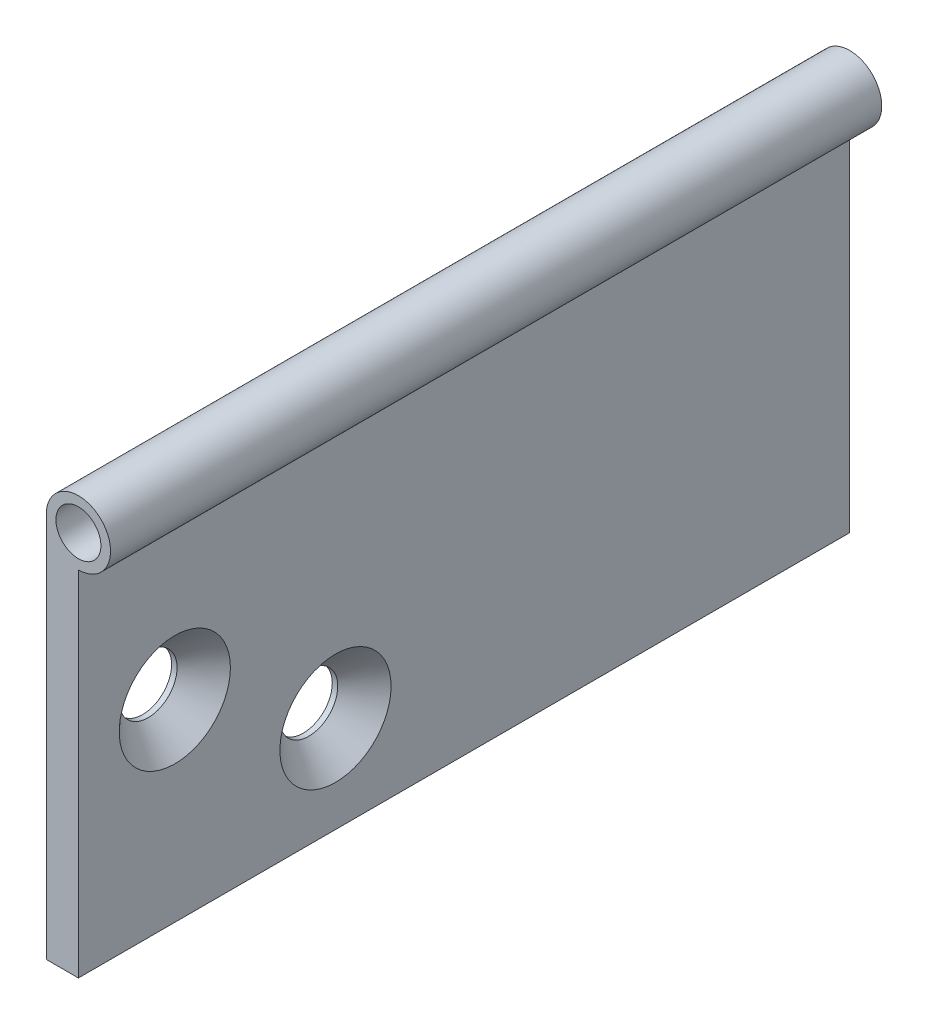
ISO-10303-21;
HEADER;
FILE_DESCRIPTION(('STEP AP214'),'2;1');
FILE_NAME('part.step','',(''),(''),'','','');
FILE_SCHEMA(('AUTOMOTIVE_DESIGN { 1 0 10303 214 1 1 1 1 }'));
ENDSEC;
DATA;
#1=APPLICATION_CONTEXT('core data for automotive mechanical design processes');
#2=APPLICATION_PROTOCOL_DEFINITION('international standard','automotive_design',2000,#1);
#3=PRODUCT_CONTEXT('',#1,'mechanical');
#4=PRODUCT('Part','Part','',(#3));
#5=PRODUCT_RELATED_PRODUCT_CATEGORY('part','',(#4));
#6=PRODUCT_DEFINITION_FORMATION('','',#4);
#7=PRODUCT_DEFINITION_CONTEXT('part definition',#1,'design');
#8=PRODUCT_DEFINITION('design','',#6,#7);
#9=PRODUCT_DEFINITION_SHAPE('','',#8);
#10=(LENGTH_UNIT() NAMED_UNIT(*) SI_UNIT(.MILLI.,.METRE.));
#11=(NAMED_UNIT(*) PLANE_ANGLE_UNIT() SI_UNIT($,.RADIAN.));
#12=(NAMED_UNIT(*) SI_UNIT($,.STERADIAN.) SOLID_ANGLE_UNIT());
#13=UNCERTAINTY_MEASURE_WITH_UNIT(LENGTH_MEASURE(1.E-05),#10,'distance_accuracy_value','');
#14=(GEOMETRIC_REPRESENTATION_CONTEXT(3) GLOBAL_UNCERTAINTY_ASSIGNED_CONTEXT((#13)) GLOBAL_UNIT_ASSIGNED_CONTEXT((#10,
#11,#12)) REPRESENTATION_CONTEXT('',''));
#15=CARTESIAN_POINT('',(0.,0.,0.));
#16=DIRECTION('',(0.,0.,1.));
#17=DIRECTION('',(1.,0.,0.));
#18=AXIS2_PLACEMENT_3D('',#15,#16,#17);
#19=CARTESIAN_POINT('',(5.,0.,60.));
#20=DIRECTION('',(-1.,0.,0.));
#21=DIRECTION('',(0.,0.,1.));
#22=AXIS2_PLACEMENT_3D('',#19,#20,#21);
#23=PLANE('',#22);
#24=CARTESIAN_POINT('',(5.,30.,45.));
#25=DIRECTION('',(1.,0.,0.));
#26=DIRECTION('',(0.,0.,-1.));
#27=AXIS2_PLACEMENT_3D('',#24,#25,#26);
#28=CIRCLE('',#27,8.65);
#29=CARTESIAN_POINT('',(5.,30.,36.35));
#30=VERTEX_POINT('',#29);
#31=EDGE_CURVE('E116',#30,#30,#28,.T.);
#32=ORIENTED_EDGE('',*,*,#31,.F.);
#33=EDGE_LOOP('',(#32));
#34=FACE_BOUND('',#33,.T.);
#35=CARTESIAN_POINT('',(5.,15.,20.));
#36=DIRECTION('',(1.,0.,0.));
#37=DIRECTION('',(0.,0.,-1.));
#38=AXIS2_PLACEMENT_3D('',#35,#36,#37);
#39=CIRCLE('',#38,8.65);
#40=CARTESIAN_POINT('',(5.,15.,11.35));
#41=VERTEX_POINT('',#40);
#42=EDGE_CURVE('E107',#41,#41,#39,.T.);
#43=ORIENTED_EDGE('',*,*,#42,.F.);
#44=EDGE_LOOP('',(#43));
#45=FACE_BOUND('',#44,.T.);
#46=DIRECTION('',(0.,1.,0.));
#47=VECTOR('',#46,1.);
#48=CARTESIAN_POINT('',(5.,0.,-60.));
#49=LINE('',#48,#47);
#50=CARTESIAN_POINT('',(5.,0.,-60.));
#51=VERTEX_POINT('',#50);
#52=CARTESIAN_POINT('',(5.,55.,-60.));
#53=VERTEX_POINT('',#52);
#54=EDGE_CURVE('E65',#51,#53,#49,.T.);
#55=ORIENTED_EDGE('',*,*,#54,.T.);
#56=DIRECTION('',(0.,0.,1.));
#57=VECTOR('',#56,1.);
#58=CARTESIAN_POINT('',(5.,55.,-60.));
#59=LINE('',#58,#57);
#60=CARTESIAN_POINT('',(5.,55.,60.));
#61=VERTEX_POINT('',#60);
#62=EDGE_CURVE('E79',#53,#61,#59,.T.);
#63=ORIENTED_EDGE('',*,*,#62,.T.);
#64=DIRECTION('',(0.,1.,0.));
#65=VECTOR('',#64,1.);
#66=CARTESIAN_POINT('',(5.,0.,60.));
#67=LINE('',#66,#65);
#68=CARTESIAN_POINT('',(5.,0.,60.));
#69=VERTEX_POINT('',#68);
#70=EDGE_CURVE('E67',#69,#61,#67,.T.);
#71=ORIENTED_EDGE('',*,*,#70,.F.);
#72=DIRECTION('',(0.,0.,-1.));
#73=VECTOR('',#72,1.);
#74=CARTESIAN_POINT('',(5.,0.,60.));
#75=LINE('',#74,#73);
#76=EDGE_CURVE('E48',#69,#51,#75,.T.);
#77=ORIENTED_EDGE('',*,*,#76,.T.);
#78=EDGE_LOOP('',(#55,#63,#71,#77));
#79=FACE_BOUND('',#78,.T.);
#80=ADVANCED_FACE('F32',(#34,#45,#79),#23,.F.);
#81=CARTESIAN_POINT('',(0.,0.,60.));
#82=DIRECTION('',(-1.,0.,0.));
#83=DIRECTION('',(0.,0.,1.));
#84=AXIS2_PLACEMENT_3D('',#81,#82,#83);
#85=PLANE('',#84);
#86=CARTESIAN_POINT('',(0.,30.,45.));
#87=DIRECTION('',(1.,0.,0.));
#88=DIRECTION('',(0.,0.,-1.));
#89=AXIS2_PLACEMENT_3D('',#86,#87,#88);
#90=CIRCLE('',#89,4.5);
#91=CARTESIAN_POINT('',(0.,30.,40.5));
#92=VERTEX_POINT('',#91);
#93=EDGE_CURVE('E110',#92,#92,#90,.T.);
#94=ORIENTED_EDGE('',*,*,#93,.T.);
#95=EDGE_LOOP('',(#94));
#96=FACE_BOUND('',#95,.T.);
#97=CARTESIAN_POINT('',(0.,15.,20.));
#98=DIRECTION('',(1.,0.,0.));
#99=DIRECTION('',(0.,0.,-1.));
#100=AXIS2_PLACEMENT_3D('',#97,#98,#99);
#101=CIRCLE('',#100,4.5);
#102=CARTESIAN_POINT('',(0.,15.,15.5));
#103=VERTEX_POINT('',#102);
#104=EDGE_CURVE('E99',#103,#103,#101,.T.);
#105=ORIENTED_EDGE('',*,*,#104,.T.);
#106=EDGE_LOOP('',(#105));
#107=FACE_BOUND('',#106,.T.);
#108=DIRECTION('',(0.,1.,0.));
#109=VECTOR('',#108,1.);
#110=CARTESIAN_POINT('',(0.,0.,-60.));
#111=LINE('',#110,#109);
#112=CARTESIAN_POINT('',(0.,0.,-60.));
#113=VERTEX_POINT('',#112);
#114=CARTESIAN_POINT('',(0.,60.,-60.));
#115=VERTEX_POINT('',#114);
#116=EDGE_CURVE('E78',#113,#115,#111,.T.);
#117=ORIENTED_EDGE('',*,*,#116,.F.);
#118=DIRECTION('',(0.,0.,-1.));
#119=VECTOR('',#118,1.);
#120=CARTESIAN_POINT('',(0.,0.,60.));
#121=LINE('',#120,#119);
#122=CARTESIAN_POINT('',(0.,0.,60.));
#123=VERTEX_POINT('',#122);
#124=EDGE_CURVE('E40',#123,#113,#121,.T.);
#125=ORIENTED_EDGE('',*,*,#124,.F.);
#126=DIRECTION('',(0.,1.,0.));
#127=VECTOR('',#126,1.);
#128=CARTESIAN_POINT('',(0.,0.,60.));
#129=LINE('',#128,#127);
#130=CARTESIAN_POINT('',(0.,60.,60.));
#131=VERTEX_POINT('',#130);
#132=EDGE_CURVE('E83',#123,#131,#129,.T.);
#133=ORIENTED_EDGE('',*,*,#132,.T.);
#134=DIRECTION('',(0.,0.,-1.));
#135=VECTOR('',#134,1.);
#136=CARTESIAN_POINT('',(0.,60.,60.));
#137=LINE('',#136,#135);
#138=EDGE_CURVE('E11',#131,#115,#137,.T.);
#139=ORIENTED_EDGE('',*,*,#138,.T.);
#140=EDGE_LOOP('',(#117,#125,#133,#139));
#141=FACE_BOUND('',#140,.T.);
#142=ADVANCED_FACE('F124',(#96,#107,#141),#85,.T.);
#143=CARTESIAN_POINT('',(5.,0.,60.));
#144=DIRECTION('',(0.,-1.,0.));
#145=DIRECTION('',(0.,0.,-1.));
#146=AXIS2_PLACEMENT_3D('',#143,#144,#145);
#147=PLANE('',#146);
#148=DIRECTION('',(-1.,0.,0.));
#149=VECTOR('',#148,1.);
#150=CARTESIAN_POINT('',(5.,0.,-60.));
#151=LINE('',#150,#149);
#152=EDGE_CURVE('E76',#51,#113,#151,.T.);
#153=ORIENTED_EDGE('',*,*,#152,.F.);
#154=ORIENTED_EDGE('',*,*,#76,.F.);
#155=DIRECTION('',(-1.,0.,0.));
#156=VECTOR('',#155,1.);
#157=CARTESIAN_POINT('',(5.,0.,60.));
#158=LINE('',#157,#156);
#159=EDGE_CURVE('E69',#69,#123,#158,.T.);
#160=ORIENTED_EDGE('',*,*,#159,.T.);
#161=ORIENTED_EDGE('',*,*,#124,.T.);
#162=EDGE_LOOP('',(#153,#154,#160,#161));
#163=FACE_BOUND('',#162,.T.);
#164=ADVANCED_FACE('F81',(#163),#147,.T.);
#165=CARTESIAN_POINT('',(0.,0.,60.));
#166=DIRECTION('',(0.,0.,-1.));
#167=DIRECTION('',(-1.,0.,0.));
#168=AXIS2_PLACEMENT_3D('',#165,#166,#167);
#169=PLANE('',#168);
#170=CARTESIAN_POINT('',(5.,60.,60.));
#171=DIRECTION('',(0.,0.,1.));
#172=DIRECTION('',(1.,0.,0.));
#173=AXIS2_PLACEMENT_3D('',#170,#171,#172);
#174=CIRCLE('',#173,3.5);
#175=CARTESIAN_POINT('',(8.5,60.,60.));
#176=VERTEX_POINT('',#175);
#177=EDGE_CURVE('E96',#176,#176,#174,.T.);
#178=ORIENTED_EDGE('',*,*,#177,.F.);
#179=EDGE_LOOP('',(#178));
#180=FACE_BOUND('',#179,.T.);
#181=ORIENTED_EDGE('',*,*,#70,.T.);
#182=CARTESIAN_POINT('',(5.,60.,60.));
#183=DIRECTION('',(0.,0.,1.));
#184=DIRECTION('',(1.,0.,0.));
#185=AXIS2_PLACEMENT_3D('',#182,#183,#184);
#186=CIRCLE('',#185,5.);
#187=EDGE_CURVE('E91',#61,#131,#186,.T.);
#188=ORIENTED_EDGE('',*,*,#187,.T.);
#189=ORIENTED_EDGE('',*,*,#132,.F.);
#190=ORIENTED_EDGE('',*,*,#159,.F.);
#191=EDGE_LOOP('',(#181,#188,#189,#190));
#192=FACE_BOUND('',#191,.T.);
#193=ADVANCED_FACE('F152',(#180,#192),#169,.F.);
#194=CARTESIAN_POINT('',(0.,0.,-60.));
#195=DIRECTION('',(0.,0.,-1.));
#196=DIRECTION('',(-1.,0.,0.));
#197=AXIS2_PLACEMENT_3D('',#194,#195,#196);
#198=PLANE('',#197);
#199=CARTESIAN_POINT('',(5.,60.,-60.));
#200=DIRECTION('',(0.,0.,1.));
#201=DIRECTION('',(1.,0.,0.));
#202=AXIS2_PLACEMENT_3D('',#199,#200,#201);
#203=CIRCLE('',#202,3.5);
#204=CARTESIAN_POINT('',(8.5,60.,-60.));
#205=VERTEX_POINT('',#204);
#206=EDGE_CURVE('E94',#205,#205,#203,.T.);
#207=ORIENTED_EDGE('',*,*,#206,.T.);
#208=EDGE_LOOP('',(#207));
#209=FACE_BOUND('',#208,.T.);
#210=ORIENTED_EDGE('',*,*,#116,.T.);
#211=CARTESIAN_POINT('',(5.,60.,-60.));
#212=DIRECTION('',(0.,0.,1.));
#213=DIRECTION('',(1.,0.,0.));
#214=AXIS2_PLACEMENT_3D('',#211,#212,#213);
#215=CIRCLE('',#214,5.);
#216=EDGE_CURVE('E77',#53,#115,#215,.T.);
#217=ORIENTED_EDGE('',*,*,#216,.F.);
#218=ORIENTED_EDGE('',*,*,#54,.F.);
#219=ORIENTED_EDGE('',*,*,#152,.T.);
#220=EDGE_LOOP('',(#210,#217,#218,#219));
#221=FACE_BOUND('',#220,.T.);
#222=ADVANCED_FACE('F75',(#209,#221),#198,.T.);
#223=CARTESIAN_POINT('',(5.,60.,-60.));
#224=DIRECTION('',(0.,0.,1.));
#225=DIRECTION('',(1.,0.,0.));
#226=AXIS2_PLACEMENT_3D('',#223,#224,#225);
#227=CYLINDRICAL_SURFACE('',#226,5.);
#228=ORIENTED_EDGE('',*,*,#62,.F.);
#229=ORIENTED_EDGE('',*,*,#216,.T.);
#230=ORIENTED_EDGE('',*,*,#138,.F.);
#231=ORIENTED_EDGE('',*,*,#187,.F.);
#232=EDGE_LOOP('',(#228,#229,#230,#231));
#233=FACE_BOUND('',#232,.T.);
#234=ADVANCED_FACE('F147',(#233),#227,.T.);
#235=CARTESIAN_POINT('',(5.,60.,-60.));
#236=DIRECTION('',(0.,0.,1.));
#237=DIRECTION('',(1.,0.,0.));
#238=AXIS2_PLACEMENT_3D('',#235,#236,#237);
#239=CYLINDRICAL_SURFACE('',#238,3.5);
#240=ORIENTED_EDGE('',*,*,#206,.F.);
#241=EDGE_LOOP('',(#240));
#242=FACE_BOUND('',#241,.T.);
#243=ORIENTED_EDGE('',*,*,#177,.T.);
#244=EDGE_LOOP('',(#243));
#245=FACE_BOUND('',#244,.T.);
#246=ADVANCED_FACE('F139',(#242,#245),#239,.F.);
#247=CARTESIAN_POINT('',(5.,15.,20.));
#248=DIRECTION('',(1.,0.,0.));
#249=DIRECTION('',(0.,0.,-1.));
#250=AXIS2_PLACEMENT_3D('',#247,#248,#249);
#251=CYLINDRICAL_SURFACE('',#250,4.5);
#252=ORIENTED_EDGE('',*,*,#104,.F.);
#253=EDGE_LOOP('',(#252));
#254=FACE_BOUND('',#253,.T.);
#255=CARTESIAN_POINT('',(0.850000000000013,15.,20.));
#256=DIRECTION('',(1.,0.,0.));
#257=DIRECTION('',(0.,0.,-1.));
#258=AXIS2_PLACEMENT_3D('',#255,#256,#257);
#259=CIRCLE('',#258,4.49999999999999);
#260=CARTESIAN_POINT('',(0.850000000000013,15.,15.5));
#261=VERTEX_POINT('',#260);
#262=EDGE_CURVE('E104',#261,#261,#259,.T.);
#263=ORIENTED_EDGE('',*,*,#262,.T.);
#264=EDGE_LOOP('',(#263));
#265=FACE_BOUND('',#264,.T.);
#266=ADVANCED_FACE('F130',(#254,#265),#251,.F.);
#267=CARTESIAN_POINT('',(5.,15.,20.));
#268=DIRECTION('',(1.,0.,0.));
#269=DIRECTION('',(0.,0.,-1.));
#270=AXIS2_PLACEMENT_3D('',#267,#268,#269);
#271=CONICAL_SURFACE('',#270,8.65,0.785398163397451);
#272=ORIENTED_EDGE('',*,*,#262,.F.);
#273=EDGE_LOOP('',(#272));
#274=FACE_BOUND('',#273,.T.);
#275=ORIENTED_EDGE('',*,*,#42,.T.);
#276=EDGE_LOOP('',(#275));
#277=FACE_BOUND('',#276,.T.);
#278=ADVANCED_FACE('F127',(#274,#277),#271,.F.);
#279=CARTESIAN_POINT('',(5.,30.,45.));
#280=DIRECTION('',(1.,0.,0.));
#281=DIRECTION('',(0.,0.,-1.));
#282=AXIS2_PLACEMENT_3D('',#279,#280,#281);
#283=CYLINDRICAL_SURFACE('',#282,4.49999999999999);
#284=ORIENTED_EDGE('',*,*,#93,.F.);
#285=EDGE_LOOP('',(#284));
#286=FACE_BOUND('',#285,.T.);
#287=CARTESIAN_POINT('',(0.850000000000013,30.,45.));
#288=DIRECTION('',(1.,0.,0.));
#289=DIRECTION('',(0.,0.,-1.));
#290=AXIS2_PLACEMENT_3D('',#287,#288,#289);
#291=CIRCLE('',#290,4.49999999999999);
#292=CARTESIAN_POINT('',(0.850000000000013,30.,40.5));
#293=VERTEX_POINT('',#292);
#294=EDGE_CURVE('E113',#293,#293,#291,.T.);
#295=ORIENTED_EDGE('',*,*,#294,.T.);
#296=EDGE_LOOP('',(#295));
#297=FACE_BOUND('',#296,.T.);
#298=ADVANCED_FACE('F129',(#286,#297),#283,.F.);
#299=CARTESIAN_POINT('',(5.,30.,45.));
#300=DIRECTION('',(1.,0.,0.));
#301=DIRECTION('',(0.,0.,-1.));
#302=AXIS2_PLACEMENT_3D('',#299,#300,#301);
#303=CONICAL_SURFACE('',#302,8.65,0.785398163397451);
#304=ORIENTED_EDGE('',*,*,#294,.F.);
#305=EDGE_LOOP('',(#304));
#306=FACE_BOUND('',#305,.T.);
#307=ORIENTED_EDGE('',*,*,#31,.T.);
#308=EDGE_LOOP('',(#307));
#309=FACE_BOUND('',#308,.T.);
#310=ADVANCED_FACE('F120',(#306,#309),#303,.F.);
#311=CLOSED_SHELL('',(#80,#142,#164,#193,#222,#234,#246,#266,#278,#298,#310));
#312=MANIFOLD_SOLID_BREP('B2',#311);
#313=ADVANCED_BREP_SHAPE_REPRESENTATION('',(#18,#312),#14);
#314=SHAPE_DEFINITION_REPRESENTATION(#9,#313);
ENDSEC;
END-ISO-10303-21;
